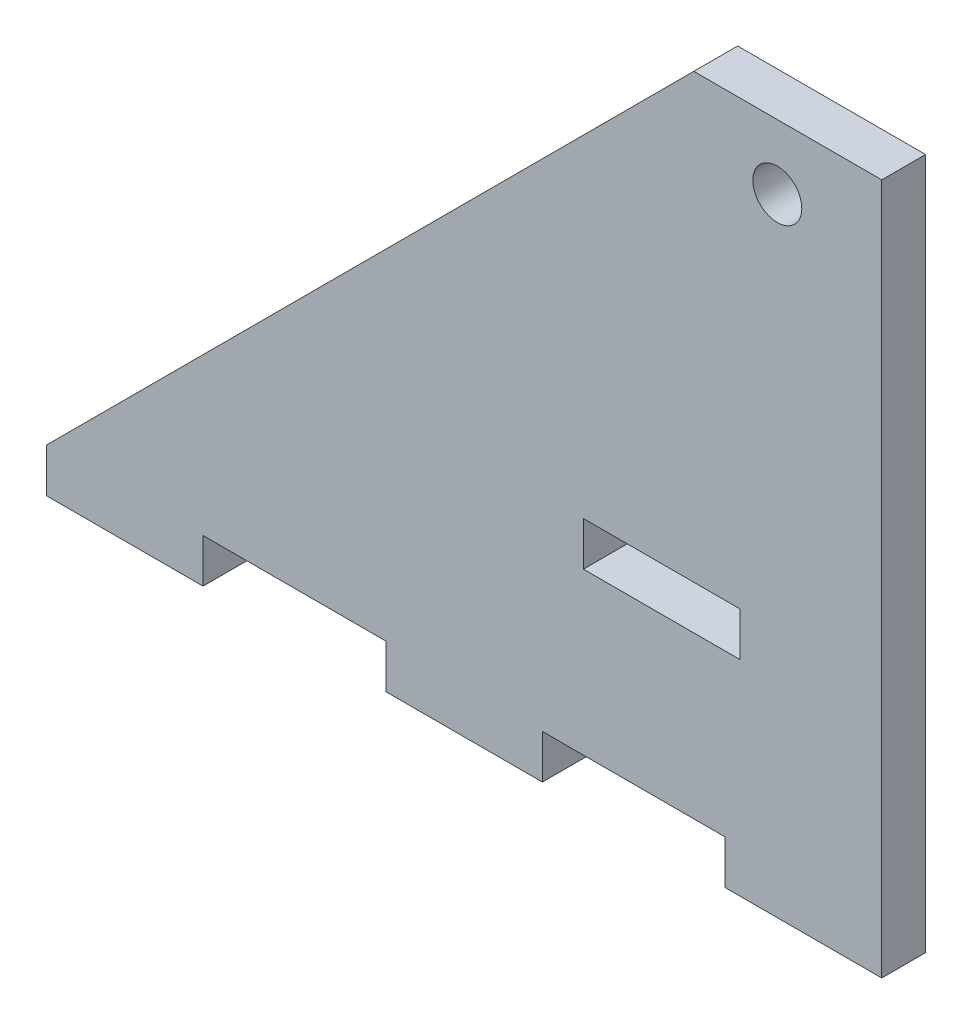
ISO-10303-21;
HEADER;
FILE_DESCRIPTION(('STEP AP214'),'2;1');
FILE_NAME('part.step','',(''),(''),'','','');
FILE_SCHEMA(('AUTOMOTIVE_DESIGN { 1 0 10303 214 1 1 1 1 }'));
ENDSEC;
DATA;
#1=APPLICATION_CONTEXT('core data for automotive mechanical design processes');
#2=APPLICATION_PROTOCOL_DEFINITION('international standard','automotive_design',2000,#1);
#3=PRODUCT_CONTEXT('',#1,'mechanical');
#4=PRODUCT('Part','Part','',(#3));
#5=PRODUCT_RELATED_PRODUCT_CATEGORY('part','',(#4));
#6=PRODUCT_DEFINITION_FORMATION('','',#4);
#7=PRODUCT_DEFINITION_CONTEXT('part definition',#1,'design');
#8=PRODUCT_DEFINITION('design','',#6,#7);
#9=PRODUCT_DEFINITION_SHAPE('','',#8);
#10=(LENGTH_UNIT() NAMED_UNIT(*) SI_UNIT(.MILLI.,.METRE.));
#11=(NAMED_UNIT(*) PLANE_ANGLE_UNIT() SI_UNIT($,.RADIAN.));
#12=(NAMED_UNIT(*) SI_UNIT($,.STERADIAN.) SOLID_ANGLE_UNIT());
#13=UNCERTAINTY_MEASURE_WITH_UNIT(LENGTH_MEASURE(1.E-05),#10,'distance_accuracy_value','');
#14=(GEOMETRIC_REPRESENTATION_CONTEXT(3) GLOBAL_UNCERTAINTY_ASSIGNED_CONTEXT((#13)) GLOBAL_UNIT_ASSIGNED_CONTEXT((#10,
#11,#12)) REPRESENTATION_CONTEXT('',''));
#15=CARTESIAN_POINT('',(0.,0.,0.));
#16=DIRECTION('',(0.,0.,1.));
#17=DIRECTION('',(1.,0.,0.));
#18=AXIS2_PLACEMENT_3D('',#15,#16,#17);
#19=CARTESIAN_POINT('',(0.,0.,5.334));
#20=DIRECTION('',(0.,1.,0.));
#21=DIRECTION('',(0.,0.,1.));
#22=AXIS2_PLACEMENT_3D('',#19,#20,#21);
#23=PLANE('',#22);
#24=DIRECTION('',(0.,0.,-1.));
#25=VECTOR('',#24,1.);
#26=CARTESIAN_POINT('',(41.275,0.,0.));
#27=LINE('',#26,#25);
#28=CARTESIAN_POINT('',(41.275,0.,5.334));
#29=VERTEX_POINT('',#28);
#30=CARTESIAN_POINT('',(41.275,0.,0.));
#31=VERTEX_POINT('',#30);
#32=EDGE_CURVE('E56',#29,#31,#27,.T.);
#33=ORIENTED_EDGE('',*,*,#32,.F.);
#34=DIRECTION('',(1.,0.,0.));
#35=VECTOR('',#34,1.);
#36=CARTESIAN_POINT('',(0.,0.,5.334));
#37=LINE('',#36,#35);
#38=CARTESIAN_POINT('',(19.05,0.,5.334));
#39=VERTEX_POINT('',#38);
#40=EDGE_CURVE('E218',#39,#29,#37,.T.);
#41=ORIENTED_EDGE('',*,*,#40,.F.);
#42=DIRECTION('',(0.,0.,1.));
#43=VECTOR('',#42,1.);
#44=CARTESIAN_POINT('',(19.05,0.,0.));
#45=LINE('',#44,#43);
#46=CARTESIAN_POINT('',(19.05,0.,0.));
#47=VERTEX_POINT('',#46);
#48=EDGE_CURVE('E200',#47,#39,#45,.T.);
#49=ORIENTED_EDGE('',*,*,#48,.F.);
#50=DIRECTION('',(1.,0.,0.));
#51=VECTOR('',#50,1.);
#52=CARTESIAN_POINT('',(0.,0.,0.));
#53=LINE('',#52,#51);
#54=EDGE_CURVE('E232',#47,#31,#53,.T.);
#55=ORIENTED_EDGE('',*,*,#54,.T.);
#56=EDGE_LOOP('',(#33,#41,#49,#55));
#57=FACE_BOUND('',#56,.T.);
#58=ADVANCED_FACE('F32',(#57),#23,.F.);
#59=DIRECTION('',(0.,0.,1.));
#60=VECTOR('',#59,1.);
#61=CARTESIAN_POINT('',(60.325,0.,0.));
#62=LINE('',#61,#60);
#63=CARTESIAN_POINT('',(60.325,0.,0.));
#64=VERTEX_POINT('',#63);
#65=CARTESIAN_POINT('',(60.325,0.,5.334));
#66=VERTEX_POINT('',#65);
#67=EDGE_CURVE('E173',#64,#66,#62,.T.);
#68=ORIENTED_EDGE('',*,*,#67,.F.);
#69=CARTESIAN_POINT('',(82.55,0.,0.));
#70=VERTEX_POINT('',#69);
#71=EDGE_CURVE('E230',#64,#70,#53,.T.);
#72=ORIENTED_EDGE('',*,*,#71,.T.);
#73=DIRECTION('',(0.,0.,-1.));
#74=VECTOR('',#73,1.);
#75=CARTESIAN_POINT('',(82.55,0.,0.));
#76=LINE('',#75,#74);
#77=CARTESIAN_POINT('',(82.55,0.,5.334));
#78=VERTEX_POINT('',#77);
#79=EDGE_CURVE('E176',#78,#70,#76,.T.);
#80=ORIENTED_EDGE('',*,*,#79,.F.);
#81=EDGE_CURVE('E35',#66,#78,#37,.T.);
#82=ORIENTED_EDGE('',*,*,#81,.F.);
#83=EDGE_LOOP('',(#68,#72,#80,#82));
#84=FACE_BOUND('',#83,.T.);
#85=ADVANCED_FACE('F349',(#84),#23,.F.);
#86=CARTESIAN_POINT('',(101.6,0.,5.334));
#87=DIRECTION('',(-1.,0.,0.));
#88=DIRECTION('',(0.,0.,1.));
#89=AXIS2_PLACEMENT_3D('',#86,#87,#88);
#90=PLANE('',#89);
#91=DIRECTION('',(0.,1.,0.));
#92=VECTOR('',#91,1.);
#93=CARTESIAN_POINT('',(101.6,0.,0.));
#94=LINE('',#93,#92);
#95=CARTESIAN_POINT('',(101.6,-5.334,0.));
#96=VERTEX_POINT('',#95);
#97=CARTESIAN_POINT('',(101.6,78.74,0.));
#98=VERTEX_POINT('',#97);
#99=EDGE_CURVE('E239',#96,#98,#94,.T.);
#100=ORIENTED_EDGE('',*,*,#99,.T.);
#101=DIRECTION('',(0.,0.,-1.));
#102=VECTOR('',#101,1.);
#103=CARTESIAN_POINT('',(101.6,78.74,5.334));
#104=LINE('',#103,#102);
#105=CARTESIAN_POINT('',(101.6,78.74,5.334));
#106=VERTEX_POINT('',#105);
#107=EDGE_CURVE('E11',#106,#98,#104,.T.);
#108=ORIENTED_EDGE('',*,*,#107,.F.);
#109=DIRECTION('',(0.,1.,0.));
#110=VECTOR('',#109,1.);
#111=CARTESIAN_POINT('',(101.6,0.,5.334));
#112=LINE('',#111,#110);
#113=CARTESIAN_POINT('',(101.6,-5.334,5.334));
#114=VERTEX_POINT('',#113);
#115=EDGE_CURVE('E271',#114,#106,#112,.T.);
#116=ORIENTED_EDGE('',*,*,#115,.F.);
#117=DIRECTION('',(0.,0.,1.));
#118=VECTOR('',#117,1.);
#119=CARTESIAN_POINT('',(101.6,-5.334,0.));
#120=LINE('',#119,#118);
#121=EDGE_CURVE('E179',#96,#114,#120,.T.);
#122=ORIENTED_EDGE('',*,*,#121,.F.);
#123=EDGE_LOOP('',(#100,#108,#116,#122));
#124=FACE_BOUND('',#123,.T.);
#125=ADVANCED_FACE('F256',(#124),#90,.F.);
#126=CARTESIAN_POINT('',(78.7400000000008,78.74,5.334));
#127=DIRECTION('',(0.,-1.,0.));
#128=DIRECTION('',(0.,0.,-1.));
#129=AXIS2_PLACEMENT_3D('',#126,#127,#128);
#130=PLANE('',#129);
#131=DIRECTION('',(-1.,0.,0.));
#132=VECTOR('',#131,1.);
#133=CARTESIAN_POINT('',(78.7400000000008,78.74,0.));
#134=LINE('',#133,#132);
#135=CARTESIAN_POINT('',(78.7400000000008,78.74,0.));
#136=VERTEX_POINT('',#135);
#137=EDGE_CURVE('E249',#98,#136,#134,.T.);
#138=ORIENTED_EDGE('',*,*,#137,.T.);
#139=DIRECTION('',(0.,0.,-1.));
#140=VECTOR('',#139,1.);
#141=CARTESIAN_POINT('',(78.7400000000008,78.74,5.334));
#142=LINE('',#141,#140);
#143=CARTESIAN_POINT('',(78.7400000000008,78.74,5.334));
#144=VERTEX_POINT('',#143);
#145=EDGE_CURVE('E41',#144,#136,#142,.T.);
#146=ORIENTED_EDGE('',*,*,#145,.F.);
#147=DIRECTION('',(-1.,0.,0.));
#148=VECTOR('',#147,1.);
#149=CARTESIAN_POINT('',(78.7400000000008,78.74,5.334));
#150=LINE('',#149,#148);
#151=EDGE_CURVE('E260',#106,#144,#150,.T.);
#152=ORIENTED_EDGE('',*,*,#151,.F.);
#153=ORIENTED_EDGE('',*,*,#107,.T.);
#154=EDGE_LOOP('',(#138,#146,#152,#153));
#155=FACE_BOUND('',#154,.T.);
#156=ADVANCED_FACE('F259',(#155),#130,.F.);
#157=CARTESIAN_POINT('',(78.7400000000008,78.74,5.334));
#158=DIRECTION('',(0.707106781186544,-0.707106781186551,0.));
#159=DIRECTION('',(0.707106781186551,0.707106781186544,0.));
#160=AXIS2_PLACEMENT_3D('',#157,#158,#159);
#161=PLANE('',#160);
#162=DIRECTION('',(-0.707106781186551,-0.707106781186544,0.));
#163=VECTOR('',#162,1.);
#164=CARTESIAN_POINT('',(78.7400000000008,78.74,0.));
#165=LINE('',#164,#163);
#166=CARTESIAN_POINT('',(0.,0.,0.));
#167=VERTEX_POINT('',#166);
#168=EDGE_CURVE('E248',#136,#167,#165,.T.);
#169=ORIENTED_EDGE('',*,*,#168,.T.);
#170=DIRECTION('',(0.,0.,-1.));
#171=VECTOR('',#170,1.);
#172=CARTESIAN_POINT('',(0.,0.,5.334));
#173=LINE('',#172,#171);
#174=CARTESIAN_POINT('',(0.,0.,5.334));
#175=VERTEX_POINT('',#174);
#176=EDGE_CURVE('E245',#175,#167,#173,.T.);
#177=ORIENTED_EDGE('',*,*,#176,.F.);
#178=DIRECTION('',(-0.707106781186551,-0.707106781186544,0.));
#179=VECTOR('',#178,1.);
#180=CARTESIAN_POINT('',(78.7400000000008,78.74,5.334));
#181=LINE('',#180,#179);
#182=EDGE_CURVE('E237',#144,#175,#181,.T.);
#183=ORIENTED_EDGE('',*,*,#182,.F.);
#184=ORIENTED_EDGE('',*,*,#145,.T.);
#185=EDGE_LOOP('',(#169,#177,#183,#184));
#186=FACE_BOUND('',#185,.T.);
#187=ADVANCED_FACE('F266',(#186),#161,.F.);
#188=CARTESIAN_POINT('',(0.,0.,5.334));
#189=DIRECTION('',(0.,0.,1.));
#190=DIRECTION('',(1.,0.,0.));
#191=AXIS2_PLACEMENT_3D('',#188,#189,#190);
#192=PLANE('',#191);
#193=DIRECTION('',(0.,-1.,0.));
#194=VECTOR('',#193,1.);
#195=CARTESIAN_POINT('',(65.3149999999999,24.9233656455816,5.334));
#196=LINE('',#195,#194);
#197=CARTESIAN_POINT('',(65.3149999999999,24.9233656455816,5.334));
#198=VERTEX_POINT('',#197);
#199=CARTESIAN_POINT('',(65.3149999999999,19.5893656455816,5.334));
#200=VERTEX_POINT('',#199);
#201=EDGE_CURVE('E301',#198,#200,#196,.T.);
#202=ORIENTED_EDGE('',*,*,#201,.F.);
#203=DIRECTION('',(-1.,0.,0.));
#204=VECTOR('',#203,1.);
#205=CARTESIAN_POINT('',(65.3149999999999,24.9233656455816,5.334));
#206=LINE('',#205,#204);
#207=CARTESIAN_POINT('',(84.3649999999999,24.9233656455817,5.334));
#208=VERTEX_POINT('',#207);
#209=EDGE_CURVE('E291',#208,#198,#206,.T.);
#210=ORIENTED_EDGE('',*,*,#209,.F.);
#211=DIRECTION('',(0.,1.,0.));
#212=VECTOR('',#211,1.);
#213=CARTESIAN_POINT('',(84.3649999999999,24.9233656455817,5.334));
#214=LINE('',#213,#212);
#215=CARTESIAN_POINT('',(84.3649999999999,19.5893656455817,5.334));
#216=VERTEX_POINT('',#215);
#217=EDGE_CURVE('E295',#216,#208,#214,.T.);
#218=ORIENTED_EDGE('',*,*,#217,.F.);
#219=DIRECTION('',(1.,0.,0.));
#220=VECTOR('',#219,1.);
#221=CARTESIAN_POINT('',(65.3149999999999,19.5893656455816,5.334));
#222=LINE('',#221,#220);
#223=EDGE_CURVE('E298',#200,#216,#222,.T.);
#224=ORIENTED_EDGE('',*,*,#223,.F.);
#225=EDGE_LOOP('',(#202,#210,#218,#224));
#226=FACE_BOUND('',#225,.T.);
#227=CARTESIAN_POINT('',(88.9,70.866,5.334));
#228=DIRECTION('',(0.,0.,1.));
#229=DIRECTION('',(1.,0.,0.));
#230=AXIS2_PLACEMENT_3D('',#227,#228,#229);
#231=CIRCLE('',#230,2.97500000000001);
#232=CARTESIAN_POINT('',(91.875,70.866,5.334));
#233=VERTEX_POINT('',#232);
#234=EDGE_CURVE('E275',#233,#233,#231,.T.);
#235=ORIENTED_EDGE('',*,*,#234,.F.);
#236=EDGE_LOOP('',(#235));
#237=FACE_BOUND('',#236,.T.);
#238=ORIENTED_EDGE('',*,*,#182,.T.);
#239=DIRECTION('',(0.,1.,0.));
#240=VECTOR('',#239,1.);
#241=CARTESIAN_POINT('',(0.,-5.334,5.334));
#242=LINE('',#241,#240);
#243=CARTESIAN_POINT('',(0.,-5.334,5.334));
#244=VERTEX_POINT('',#243);
#245=EDGE_CURVE('E210',#244,#175,#242,.T.);
#246=ORIENTED_EDGE('',*,*,#245,.F.);
#247=DIRECTION('',(-1.,0.,0.));
#248=VECTOR('',#247,1.);
#249=CARTESIAN_POINT('',(0.,-5.334,5.334));
#250=LINE('',#249,#248);
#251=CARTESIAN_POINT('',(19.05,-5.334,5.334));
#252=VERTEX_POINT('',#251);
#253=EDGE_CURVE('E208',#252,#244,#250,.T.);
#254=ORIENTED_EDGE('',*,*,#253,.F.);
#255=DIRECTION('',(0.,1.,0.));
#256=VECTOR('',#255,1.);
#257=CARTESIAN_POINT('',(19.05,-5.334,5.334));
#258=LINE('',#257,#256);
#259=EDGE_CURVE('E220',#252,#39,#258,.T.);
#260=ORIENTED_EDGE('',*,*,#259,.T.);
#261=ORIENTED_EDGE('',*,*,#40,.T.);
#262=DIRECTION('',(0.,1.,0.));
#263=VECTOR('',#262,1.);
#264=CARTESIAN_POINT('',(41.275,-5.334,5.334));
#265=LINE('',#264,#263);
#266=CARTESIAN_POINT('',(41.275,-5.334,5.334));
#267=VERTEX_POINT('',#266);
#268=EDGE_CURVE('E362',#267,#29,#265,.T.);
#269=ORIENTED_EDGE('',*,*,#268,.F.);
#270=DIRECTION('',(-1.,0.,0.));
#271=VECTOR('',#270,1.);
#272=CARTESIAN_POINT('',(41.275,-5.334,5.334));
#273=LINE('',#272,#271);
#274=CARTESIAN_POINT('',(60.325,-5.334,5.334));
#275=VERTEX_POINT('',#274);
#276=EDGE_CURVE('E169',#275,#267,#273,.T.);
#277=ORIENTED_EDGE('',*,*,#276,.F.);
#278=DIRECTION('',(0.,1.,0.));
#279=VECTOR('',#278,1.);
#280=CARTESIAN_POINT('',(60.325,-5.334,5.334));
#281=LINE('',#280,#279);
#282=EDGE_CURVE('E181',#275,#66,#281,.T.);
#283=ORIENTED_EDGE('',*,*,#282,.T.);
#284=ORIENTED_EDGE('',*,*,#81,.T.);
#285=DIRECTION('',(0.,1.,0.));
#286=VECTOR('',#285,1.);
#287=CARTESIAN_POINT('',(82.55,-5.334,5.334));
#288=LINE('',#287,#286);
#289=CARTESIAN_POINT('',(82.55,-5.334,5.334));
#290=VERTEX_POINT('',#289);
#291=EDGE_CURVE('E197',#290,#78,#288,.T.);
#292=ORIENTED_EDGE('',*,*,#291,.F.);
#293=DIRECTION('',(-1.,0.,0.));
#294=VECTOR('',#293,1.);
#295=CARTESIAN_POINT('',(101.6,-5.334,5.334));
#296=LINE('',#295,#294);
#297=EDGE_CURVE('E187',#114,#290,#296,.T.);
#298=ORIENTED_EDGE('',*,*,#297,.F.);
#299=ORIENTED_EDGE('',*,*,#115,.T.);
#300=ORIENTED_EDGE('',*,*,#151,.T.);
#301=EDGE_LOOP('',(#238,#246,#254,#260,#261,#269,#277,#283,#284,#292,#298,#299,#300));
#302=FACE_BOUND('',#301,.T.);
#303=ADVANCED_FACE('F331',(#226,#237,#302),#192,.T.);
#304=CARTESIAN_POINT('',(0.,0.,0.));
#305=DIRECTION('',(0.,0.,1.));
#306=DIRECTION('',(1.,0.,0.));
#307=AXIS2_PLACEMENT_3D('',#304,#305,#306);
#308=PLANE('',#307);
#309=DIRECTION('',(-1.,0.,0.));
#310=VECTOR('',#309,1.);
#311=CARTESIAN_POINT('',(65.3149999999999,24.9233656455816,0.));
#312=LINE('',#311,#310);
#313=CARTESIAN_POINT('',(84.3649999999999,24.9233656455817,0.));
#314=VERTEX_POINT('',#313);
#315=CARTESIAN_POINT('',(65.3149999999999,24.9233656455816,0.));
#316=VERTEX_POINT('',#315);
#317=EDGE_CURVE('E286',#314,#316,#312,.T.);
#318=ORIENTED_EDGE('',*,*,#317,.T.);
#319=DIRECTION('',(0.,-1.,0.));
#320=VECTOR('',#319,1.);
#321=CARTESIAN_POINT('',(65.3149999999999,24.9233656455816,0.));
#322=LINE('',#321,#320);
#323=CARTESIAN_POINT('',(65.3149999999999,19.5893656455816,0.));
#324=VERTEX_POINT('',#323);
#325=EDGE_CURVE('E294',#316,#324,#322,.T.);
#326=ORIENTED_EDGE('',*,*,#325,.T.);
#327=DIRECTION('',(1.,0.,0.));
#328=VECTOR('',#327,1.);
#329=CARTESIAN_POINT('',(65.3149999999999,19.5893656455816,0.));
#330=LINE('',#329,#328);
#331=CARTESIAN_POINT('',(84.3649999999999,19.5893656455817,0.));
#332=VERTEX_POINT('',#331);
#333=EDGE_CURVE('E308',#324,#332,#330,.T.);
#334=ORIENTED_EDGE('',*,*,#333,.T.);
#335=DIRECTION('',(0.,1.,0.));
#336=VECTOR('',#335,1.);
#337=CARTESIAN_POINT('',(84.3649999999999,24.9233656455817,0.));
#338=LINE('',#337,#336);
#339=EDGE_CURVE('E305',#332,#314,#338,.T.);
#340=ORIENTED_EDGE('',*,*,#339,.T.);
#341=EDGE_LOOP('',(#318,#326,#334,#340));
#342=FACE_BOUND('',#341,.T.);
#343=CARTESIAN_POINT('',(88.9,70.866,0.));
#344=DIRECTION('',(0.,0.,1.));
#345=DIRECTION('',(1.,0.,0.));
#346=AXIS2_PLACEMENT_3D('',#343,#344,#345);
#347=CIRCLE('',#346,2.97500000000001);
#348=CARTESIAN_POINT('',(91.875,70.866,0.));
#349=VERTEX_POINT('',#348);
#350=EDGE_CURVE('E233',#349,#349,#347,.T.);
#351=ORIENTED_EDGE('',*,*,#350,.T.);
#352=EDGE_LOOP('',(#351));
#353=FACE_BOUND('',#352,.T.);
#354=ORIENTED_EDGE('',*,*,#54,.F.);
#355=DIRECTION('',(0.,1.,0.));
#356=VECTOR('',#355,1.);
#357=CARTESIAN_POINT('',(19.05,-5.334,0.));
#358=LINE('',#357,#356);
#359=CARTESIAN_POINT('',(19.05,-5.334,0.));
#360=VERTEX_POINT('',#359);
#361=EDGE_CURVE('E223',#360,#47,#358,.T.);
#362=ORIENTED_EDGE('',*,*,#361,.F.);
#363=DIRECTION('',(1.,0.,0.));
#364=VECTOR('',#363,1.);
#365=CARTESIAN_POINT('',(0.,-5.334,0.));
#366=LINE('',#365,#364);
#367=CARTESIAN_POINT('',(0.,-5.334,0.));
#368=VERTEX_POINT('',#367);
#369=EDGE_CURVE('E204',#368,#360,#366,.T.);
#370=ORIENTED_EDGE('',*,*,#369,.F.);
#371=DIRECTION('',(0.,1.,0.));
#372=VECTOR('',#371,1.);
#373=CARTESIAN_POINT('',(0.,-5.334,0.));
#374=LINE('',#373,#372);
#375=EDGE_CURVE('E228',#368,#167,#374,.T.);
#376=ORIENTED_EDGE('',*,*,#375,.T.);
#377=ORIENTED_EDGE('',*,*,#168,.F.);
#378=ORIENTED_EDGE('',*,*,#137,.F.);
#379=ORIENTED_EDGE('',*,*,#99,.F.);
#380=DIRECTION('',(1.,0.,0.));
#381=VECTOR('',#380,1.);
#382=CARTESIAN_POINT('',(101.6,-5.334,0.));
#383=LINE('',#382,#381);
#384=CARTESIAN_POINT('',(82.55,-5.334,0.));
#385=VERTEX_POINT('',#384);
#386=EDGE_CURVE('E191',#385,#96,#383,.T.);
#387=ORIENTED_EDGE('',*,*,#386,.F.);
#388=DIRECTION('',(0.,1.,0.));
#389=VECTOR('',#388,1.);
#390=CARTESIAN_POINT('',(82.55,-5.334,0.));
#391=LINE('',#390,#389);
#392=EDGE_CURVE('E193',#385,#70,#391,.T.);
#393=ORIENTED_EDGE('',*,*,#392,.T.);
#394=ORIENTED_EDGE('',*,*,#71,.F.);
#395=DIRECTION('',(0.,1.,0.));
#396=VECTOR('',#395,1.);
#397=CARTESIAN_POINT('',(60.325,-5.334,0.));
#398=LINE('',#397,#396);
#399=CARTESIAN_POINT('',(60.325,-5.334,0.));
#400=VERTEX_POINT('',#399);
#401=EDGE_CURVE('E160',#400,#64,#398,.T.);
#402=ORIENTED_EDGE('',*,*,#401,.F.);
#403=DIRECTION('',(1.,0.,0.));
#404=VECTOR('',#403,1.);
#405=CARTESIAN_POINT('',(41.275,-5.334,0.));
#406=LINE('',#405,#404);
#407=CARTESIAN_POINT('',(41.275,-5.334,0.));
#408=VERTEX_POINT('',#407);
#409=EDGE_CURVE('E153',#408,#400,#406,.T.);
#410=ORIENTED_EDGE('',*,*,#409,.F.);
#411=DIRECTION('',(0.,1.,0.));
#412=VECTOR('',#411,1.);
#413=CARTESIAN_POINT('',(41.275,-5.334,0.));
#414=LINE('',#413,#412);
#415=EDGE_CURVE('E158',#408,#31,#414,.T.);
#416=ORIENTED_EDGE('',*,*,#415,.T.);
#417=EDGE_LOOP('',(#354,#362,#370,#376,#377,#378,#379,#387,#393,#394,#402,#410,#416));
#418=FACE_BOUND('',#417,.T.);
#419=ADVANCED_FACE('F156',(#342,#353,#418),#308,.F.);
#420=CARTESIAN_POINT('',(88.9,70.866,0.));
#421=DIRECTION('',(0.,0.,1.));
#422=DIRECTION('',(1.,0.,0.));
#423=AXIS2_PLACEMENT_3D('',#420,#421,#422);
#424=CYLINDRICAL_SURFACE('',#423,2.97500000000001);
#425=ORIENTED_EDGE('',*,*,#350,.F.);
#426=EDGE_LOOP('',(#425));
#427=FACE_BOUND('',#426,.T.);
#428=ORIENTED_EDGE('',*,*,#234,.T.);
#429=EDGE_LOOP('',(#428));
#430=FACE_BOUND('',#429,.T.);
#431=ADVANCED_FACE('F337',(#427,#430),#424,.F.);
#432=CARTESIAN_POINT('',(65.3149999999999,24.9233656455816,0.));
#433=DIRECTION('',(-1.,0.,0.));
#434=DIRECTION('',(0.,0.,1.));
#435=AXIS2_PLACEMENT_3D('',#432,#433,#434);
#436=PLANE('',#435);
#437=ORIENTED_EDGE('',*,*,#201,.T.);
#438=DIRECTION('',(0.,0.,1.));
#439=VECTOR('',#438,1.);
#440=CARTESIAN_POINT('',(65.3149999999999,19.5893656455816,0.));
#441=LINE('',#440,#439);
#442=EDGE_CURVE('E282',#324,#200,#441,.T.);
#443=ORIENTED_EDGE('',*,*,#442,.F.);
#444=ORIENTED_EDGE('',*,*,#325,.F.);
#445=DIRECTION('',(0.,0.,1.));
#446=VECTOR('',#445,1.);
#447=CARTESIAN_POINT('',(65.3149999999999,24.9233656455816,0.));
#448=LINE('',#447,#446);
#449=EDGE_CURVE('E279',#316,#198,#448,.T.);
#450=ORIENTED_EDGE('',*,*,#449,.T.);
#451=EDGE_LOOP('',(#437,#443,#444,#450));
#452=FACE_BOUND('',#451,.T.);
#453=ADVANCED_FACE('F318',(#452),#436,.F.);
#454=CARTESIAN_POINT('',(65.3149999999999,24.9233656455816,0.));
#455=DIRECTION('',(0.,1.,0.));
#456=DIRECTION('',(-1.,0.,0.));
#457=AXIS2_PLACEMENT_3D('',#454,#455,#456);
#458=PLANE('',#457);
#459=ORIENTED_EDGE('',*,*,#209,.T.);
#460=ORIENTED_EDGE('',*,*,#449,.F.);
#461=ORIENTED_EDGE('',*,*,#317,.F.);
#462=DIRECTION('',(0.,0.,1.));
#463=VECTOR('',#462,1.);
#464=CARTESIAN_POINT('',(84.3649999999999,24.9233656455817,0.));
#465=LINE('',#464,#463);
#466=EDGE_CURVE('E288',#314,#208,#465,.T.);
#467=ORIENTED_EDGE('',*,*,#466,.T.);
#468=EDGE_LOOP('',(#459,#460,#461,#467));
#469=FACE_BOUND('',#468,.T.);
#470=ADVANCED_FACE('F329',(#469),#458,.F.);
#471=CARTESIAN_POINT('',(84.3649999999999,24.9233656455817,0.));
#472=DIRECTION('',(1.,0.,0.));
#473=DIRECTION('',(0.,1.,0.));
#474=AXIS2_PLACEMENT_3D('',#471,#472,#473);
#475=PLANE('',#474);
#476=ORIENTED_EDGE('',*,*,#217,.T.);
#477=ORIENTED_EDGE('',*,*,#466,.F.);
#478=ORIENTED_EDGE('',*,*,#339,.F.);
#479=DIRECTION('',(0.,0.,1.));
#480=VECTOR('',#479,1.);
#481=CARTESIAN_POINT('',(84.3649999999999,19.5893656455817,0.));
#482=LINE('',#481,#480);
#483=EDGE_CURVE('E285',#332,#216,#482,.T.);
#484=ORIENTED_EDGE('',*,*,#483,.T.);
#485=EDGE_LOOP('',(#476,#477,#478,#484));
#486=FACE_BOUND('',#485,.T.);
#487=ADVANCED_FACE('F326',(#486),#475,.F.);
#488=CARTESIAN_POINT('',(65.3149999999999,19.5893656455816,0.));
#489=DIRECTION('',(0.,-1.,0.));
#490=DIRECTION('',(1.,0.,0.));
#491=AXIS2_PLACEMENT_3D('',#488,#489,#490);
#492=PLANE('',#491);
#493=ORIENTED_EDGE('',*,*,#223,.T.);
#494=ORIENTED_EDGE('',*,*,#483,.F.);
#495=ORIENTED_EDGE('',*,*,#333,.F.);
#496=ORIENTED_EDGE('',*,*,#442,.T.);
#497=EDGE_LOOP('',(#493,#494,#495,#496));
#498=FACE_BOUND('',#497,.T.);
#499=ADVANCED_FACE('F323',(#498),#492,.F.);
#500=CARTESIAN_POINT('',(0.,-5.334,0.));
#501=DIRECTION('',(1.,0.,0.));
#502=DIRECTION('',(0.,0.,-1.));
#503=AXIS2_PLACEMENT_3D('',#500,#501,#502);
#504=PLANE('',#503);
#505=ORIENTED_EDGE('',*,*,#176,.T.);
#506=ORIENTED_EDGE('',*,*,#375,.F.);
#507=DIRECTION('',(0.,0.,-1.));
#508=VECTOR('',#507,1.);
#509=CARTESIAN_POINT('',(0.,-5.334,0.));
#510=LINE('',#509,#508);
#511=EDGE_CURVE('E201',#244,#368,#510,.T.);
#512=ORIENTED_EDGE('',*,*,#511,.F.);
#513=ORIENTED_EDGE('',*,*,#245,.T.);
#514=EDGE_LOOP('',(#505,#506,#512,#513));
#515=FACE_BOUND('',#514,.T.);
#516=ADVANCED_FACE('F377',(#515),#504,.F.);
#517=CARTESIAN_POINT('',(19.05,-5.334,0.));
#518=DIRECTION('',(-1.,0.,0.));
#519=DIRECTION('',(0.,0.,1.));
#520=AXIS2_PLACEMENT_3D('',#517,#518,#519);
#521=PLANE('',#520);
#522=ORIENTED_EDGE('',*,*,#48,.T.);
#523=ORIENTED_EDGE('',*,*,#259,.F.);
#524=DIRECTION('',(0.,0.,1.));
#525=VECTOR('',#524,1.);
#526=CARTESIAN_POINT('',(19.05,-5.334,0.));
#527=LINE('',#526,#525);
#528=EDGE_CURVE('E206',#360,#252,#527,.T.);
#529=ORIENTED_EDGE('',*,*,#528,.F.);
#530=ORIENTED_EDGE('',*,*,#361,.T.);
#531=EDGE_LOOP('',(#522,#523,#529,#530));
#532=FACE_BOUND('',#531,.T.);
#533=ADVANCED_FACE('F370',(#532),#521,.F.);
#534=CARTESIAN_POINT('',(0.,-5.334,0.));
#535=DIRECTION('',(0.,1.,0.));
#536=DIRECTION('',(0.,0.,1.));
#537=AXIS2_PLACEMENT_3D('',#534,#535,#536);
#538=PLANE('',#537);
#539=ORIENTED_EDGE('',*,*,#511,.T.);
#540=ORIENTED_EDGE('',*,*,#369,.T.);
#541=ORIENTED_EDGE('',*,*,#528,.T.);
#542=ORIENTED_EDGE('',*,*,#253,.T.);
#543=EDGE_LOOP('',(#539,#540,#541,#542));
#544=FACE_BOUND('',#543,.T.);
#545=ADVANCED_FACE('F375',(#544),#538,.F.);
#546=CARTESIAN_POINT('',(82.55,-5.334,0.));
#547=DIRECTION('',(1.,0.,0.));
#548=DIRECTION('',(0.,0.,-1.));
#549=AXIS2_PLACEMENT_3D('',#546,#547,#548);
#550=PLANE('',#549);
#551=ORIENTED_EDGE('',*,*,#79,.T.);
#552=ORIENTED_EDGE('',*,*,#392,.F.);
#553=DIRECTION('',(0.,0.,-1.));
#554=VECTOR('',#553,1.);
#555=CARTESIAN_POINT('',(82.55,-5.334,0.));
#556=LINE('',#555,#554);
#557=EDGE_CURVE('E189',#290,#385,#556,.T.);
#558=ORIENTED_EDGE('',*,*,#557,.F.);
#559=ORIENTED_EDGE('',*,*,#291,.T.);
#560=EDGE_LOOP('',(#551,#552,#558,#559));
#561=FACE_BOUND('',#560,.T.);
#562=ADVANCED_FACE('F460',(#561),#550,.F.);
#563=CARTESIAN_POINT('',(0.,-5.334,0.));
#564=DIRECTION('',(0.,-1.,0.));
#565=DIRECTION('',(0.,0.,-1.));
#566=AXIS2_PLACEMENT_3D('',#563,#564,#565);
#567=PLANE('',#566);
#568=ORIENTED_EDGE('',*,*,#121,.T.);
#569=ORIENTED_EDGE('',*,*,#297,.T.);
#570=ORIENTED_EDGE('',*,*,#557,.T.);
#571=ORIENTED_EDGE('',*,*,#386,.T.);
#572=EDGE_LOOP('',(#568,#569,#570,#571));
#573=FACE_BOUND('',#572,.T.);
#574=ADVANCED_FACE('F468',(#573),#567,.T.);
#575=CARTESIAN_POINT('',(41.275,-5.334,0.));
#576=DIRECTION('',(1.,0.,0.));
#577=DIRECTION('',(0.,0.,-1.));
#578=AXIS2_PLACEMENT_3D('',#575,#576,#577);
#579=PLANE('',#578);
#580=ORIENTED_EDGE('',*,*,#32,.T.);
#581=ORIENTED_EDGE('',*,*,#415,.F.);
#582=DIRECTION('',(0.,0.,-1.));
#583=VECTOR('',#582,1.);
#584=CARTESIAN_POINT('',(41.275,-5.334,0.));
#585=LINE('',#584,#583);
#586=EDGE_CURVE('E164',#267,#408,#585,.T.);
#587=ORIENTED_EDGE('',*,*,#586,.F.);
#588=ORIENTED_EDGE('',*,*,#268,.T.);
#589=EDGE_LOOP('',(#580,#581,#587,#588));
#590=FACE_BOUND('',#589,.T.);
#591=ADVANCED_FACE('F175',(#590),#579,.F.);
#592=CARTESIAN_POINT('',(60.325,-5.334,0.));
#593=DIRECTION('',(-1.,0.,0.));
#594=DIRECTION('',(0.,0.,1.));
#595=AXIS2_PLACEMENT_3D('',#592,#593,#594);
#596=PLANE('',#595);
#597=ORIENTED_EDGE('',*,*,#67,.T.);
#598=ORIENTED_EDGE('',*,*,#282,.F.);
#599=DIRECTION('',(0.,0.,1.));
#600=VECTOR('',#599,1.);
#601=CARTESIAN_POINT('',(60.325,-5.334,0.));
#602=LINE('',#601,#600);
#603=EDGE_CURVE('E163',#400,#275,#602,.T.);
#604=ORIENTED_EDGE('',*,*,#603,.F.);
#605=ORIENTED_EDGE('',*,*,#401,.T.);
#606=EDGE_LOOP('',(#597,#598,#604,#605));
#607=FACE_BOUND('',#606,.T.);
#608=ADVANCED_FACE('F360',(#607),#596,.F.);
#609=CARTESIAN_POINT('',(0.,-5.334,0.));
#610=DIRECTION('',(0.,1.,0.));
#611=DIRECTION('',(0.,0.,1.));
#612=AXIS2_PLACEMENT_3D('',#609,#610,#611);
#613=PLANE('',#612);
#614=ORIENTED_EDGE('',*,*,#586,.T.);
#615=ORIENTED_EDGE('',*,*,#409,.T.);
#616=ORIENTED_EDGE('',*,*,#603,.T.);
#617=ORIENTED_EDGE('',*,*,#276,.T.);
#618=EDGE_LOOP('',(#614,#615,#616,#617));
#619=FACE_BOUND('',#618,.T.);
#620=ADVANCED_FACE('F167',(#619),#613,.F.);
#621=CLOSED_SHELL('',(#58,#85,#125,#156,#187,#303,#419,#431,#453,#470,#487,#499,#516,#533,#545,
#562,#574,#591,#608,#620));
#622=MANIFOLD_SOLID_BREP('B2',#621);
#623=ADVANCED_BREP_SHAPE_REPRESENTATION('',(#18,#622),#14);
#624=SHAPE_DEFINITION_REPRESENTATION(#9,#623);
ENDSEC;
END-ISO-10303-21;
